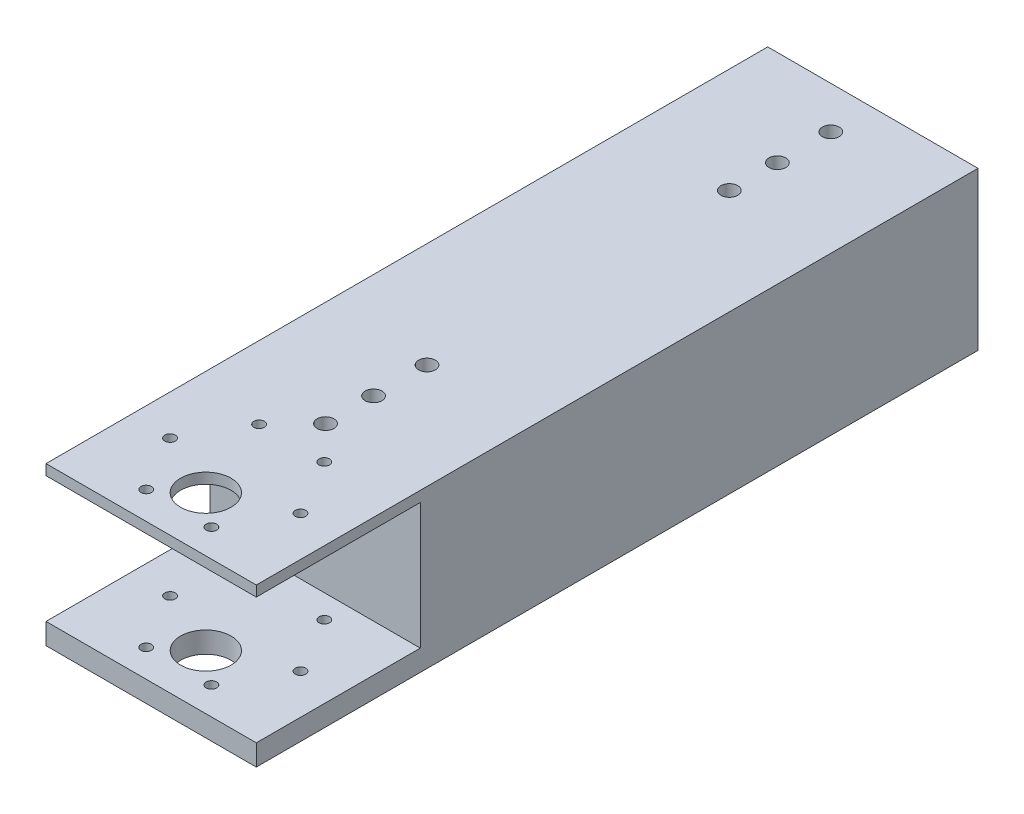
ISO-10303-21;
HEADER;
FILE_DESCRIPTION(('STEP AP214'),'2;1');
FILE_NAME('part.step','',(''),(''),'','','');
FILE_SCHEMA(('AUTOMOTIVE_DESIGN { 1 0 10303 214 1 1 1 1 }'));
ENDSEC;
DATA;
#1=APPLICATION_CONTEXT('core data for automotive mechanical design processes');
#2=APPLICATION_PROTOCOL_DEFINITION('international standard','automotive_design',2000,#1);
#3=PRODUCT_CONTEXT('',#1,'mechanical');
#4=PRODUCT('Part','Part','',(#3));
#5=PRODUCT_RELATED_PRODUCT_CATEGORY('part','',(#4));
#6=PRODUCT_DEFINITION_FORMATION('','',#4);
#7=PRODUCT_DEFINITION_CONTEXT('part definition',#1,'design');
#8=PRODUCT_DEFINITION('design','',#6,#7);
#9=PRODUCT_DEFINITION_SHAPE('','',#8);
#10=(LENGTH_UNIT() NAMED_UNIT(*) SI_UNIT(.MILLI.,.METRE.));
#11=(NAMED_UNIT(*) PLANE_ANGLE_UNIT() SI_UNIT($,.RADIAN.));
#12=(NAMED_UNIT(*) SI_UNIT($,.STERADIAN.) SOLID_ANGLE_UNIT());
#13=UNCERTAINTY_MEASURE_WITH_UNIT(LENGTH_MEASURE(1.E-05),#10,'distance_accuracy_value','');
#14=(GEOMETRIC_REPRESENTATION_CONTEXT(3) GLOBAL_UNCERTAINTY_ASSIGNED_CONTEXT((#13)) GLOBAL_UNIT_ASSIGNED_CONTEXT((#10,
#11,#12)) REPRESENTATION_CONTEXT('',''));
#15=CARTESIAN_POINT('',(0.,0.,0.));
#16=DIRECTION('',(0.,0.,1.));
#17=DIRECTION('',(1.,0.,0.));
#18=AXIS2_PLACEMENT_3D('',#15,#16,#17);
#19=CARTESIAN_POINT('',(-25.,37.5,0.));
#20=DIRECTION('',(1.,0.,0.));
#21=DIRECTION('',(0.,0.,-1.));
#22=AXIS2_PLACEMENT_3D('',#19,#20,#21);
#23=PLANE('',#22);
#24=DIRECTION('',(0.,0.,-1.));
#25=VECTOR('',#24,1.);
#26=CARTESIAN_POINT('',(-25.,35.,0.));
#27=LINE('',#26,#25);
#28=CARTESIAN_POINT('',(-25.,35.,0.));
#29=VERTEX_POINT('',#28);
#30=CARTESIAN_POINT('',(-25.,35.,-39.));
#31=VERTEX_POINT('',#30);
#32=EDGE_CURVE('E124',#29,#31,#27,.T.);
#33=ORIENTED_EDGE('',*,*,#32,.F.);
#34=DIRECTION('',(0.,-1.,0.));
#35=VECTOR('',#34,1.);
#36=CARTESIAN_POINT('',(-25.,37.5,0.));
#37=LINE('',#36,#35);
#38=CARTESIAN_POINT('',(-25.,37.5,0.));
#39=VERTEX_POINT('',#38);
#40=EDGE_CURVE('E11',#39,#29,#37,.T.);
#41=ORIENTED_EDGE('',*,*,#40,.F.);
#42=DIRECTION('',(0.,0.,1.));
#43=VECTOR('',#42,1.);
#44=CARTESIAN_POINT('',(-25.,37.5,0.));
#45=LINE('',#44,#43);
#46=CARTESIAN_POINT('',(-25.,37.5,-171.6));
#47=VERTEX_POINT('',#46);
#48=EDGE_CURVE('E178',#47,#39,#45,.T.);
#49=ORIENTED_EDGE('',*,*,#48,.F.);
#50=DIRECTION('',(0.,-1.,0.));
#51=VECTOR('',#50,1.);
#52=CARTESIAN_POINT('',(-25.,37.5,-171.6));
#53=LINE('',#52,#51);
#54=CARTESIAN_POINT('',(-25.,0.,-171.6));
#55=VERTEX_POINT('',#54);
#56=EDGE_CURVE('E184',#47,#55,#53,.T.);
#57=ORIENTED_EDGE('',*,*,#56,.T.);
#58=DIRECTION('',(0.,0.,1.));
#59=VECTOR('',#58,1.);
#60=CARTESIAN_POINT('',(-25.,0.,0.));
#61=LINE('',#60,#59);
#62=CARTESIAN_POINT('',(-25.,0.,0.));
#63=VERTEX_POINT('',#62);
#64=EDGE_CURVE('E175',#55,#63,#61,.T.);
#65=ORIENTED_EDGE('',*,*,#64,.T.);
#66=CARTESIAN_POINT('',(-25.,5.,0.));
#67=VERTEX_POINT('',#66);
#68=EDGE_CURVE('E47',#67,#63,#37,.T.);
#69=ORIENTED_EDGE('',*,*,#68,.F.);
#70=DIRECTION('',(0.,0.,-1.));
#71=VECTOR('',#70,1.);
#72=CARTESIAN_POINT('',(-25.,5.,0.));
#73=LINE('',#72,#71);
#74=CARTESIAN_POINT('',(-25.,5.,-39.));
#75=VERTEX_POINT('',#74);
#76=EDGE_CURVE('E135',#67,#75,#73,.T.);
#77=ORIENTED_EDGE('',*,*,#76,.T.);
#78=DIRECTION('',(0.,-1.,0.));
#79=VECTOR('',#78,1.);
#80=CARTESIAN_POINT('',(-25.,35.,-39.));
#81=LINE('',#80,#79);
#82=EDGE_CURVE('E117',#31,#75,#81,.T.);
#83=ORIENTED_EDGE('',*,*,#82,.F.);
#84=EDGE_LOOP('',(#33,#41,#49,#57,#65,#69,#77,#83));
#85=FACE_BOUND('',#84,.T.);
#86=ADVANCED_FACE('F40',(#85),#23,.F.);
#87=CARTESIAN_POINT('',(-25.,37.5,0.));
#88=DIRECTION('',(0.,0.,-1.));
#89=DIRECTION('',(-1.,0.,0.));
#90=AXIS2_PLACEMENT_3D('',#87,#88,#89);
#91=PLANE('',#90);
#92=DIRECTION('',(-1.,0.,0.));
#93=VECTOR('',#92,1.);
#94=CARTESIAN_POINT('',(-25.,35.,0.));
#95=LINE('',#94,#93);
#96=CARTESIAN_POINT('',(25.,35.,0.));
#97=VERTEX_POINT('',#96);
#98=EDGE_CURVE('E129',#97,#29,#95,.T.);
#99=ORIENTED_EDGE('',*,*,#98,.F.);
#100=DIRECTION('',(0.,-1.,0.));
#101=VECTOR('',#100,1.);
#102=CARTESIAN_POINT('',(25.,37.5,0.));
#103=LINE('',#102,#101);
#104=CARTESIAN_POINT('',(25.,37.5,0.));
#105=VERTEX_POINT('',#104);
#106=EDGE_CURVE('E196',#105,#97,#103,.T.);
#107=ORIENTED_EDGE('',*,*,#106,.F.);
#108=DIRECTION('',(1.,0.,0.));
#109=VECTOR('',#108,1.);
#110=CARTESIAN_POINT('',(-25.,37.5,0.));
#111=LINE('',#110,#109);
#112=EDGE_CURVE('E91',#39,#105,#111,.T.);
#113=ORIENTED_EDGE('',*,*,#112,.F.);
#114=ORIENTED_EDGE('',*,*,#40,.T.);
#115=EDGE_LOOP('',(#99,#107,#113,#114));
#116=FACE_BOUND('',#115,.T.);
#117=ADVANCED_FACE('F216',(#116),#91,.F.);
#118=CARTESIAN_POINT('',(25.,37.5,0.));
#119=DIRECTION('',(-1.,0.,0.));
#120=DIRECTION('',(0.,0.,1.));
#121=AXIS2_PLACEMENT_3D('',#118,#119,#120);
#122=PLANE('',#121);
#123=DIRECTION('',(0.,0.,1.));
#124=VECTOR('',#123,1.);
#125=CARTESIAN_POINT('',(25.,35.,0.));
#126=LINE('',#125,#124);
#127=CARTESIAN_POINT('',(25.,35.,-39.));
#128=VERTEX_POINT('',#127);
#129=EDGE_CURVE('E123',#128,#97,#126,.T.);
#130=ORIENTED_EDGE('',*,*,#129,.F.);
#131=DIRECTION('',(0.,-1.,0.));
#132=VECTOR('',#131,1.);
#133=CARTESIAN_POINT('',(25.,35.,-39.));
#134=LINE('',#133,#132);
#135=CARTESIAN_POINT('',(25.,5.,-39.));
#136=VERTEX_POINT('',#135);
#137=EDGE_CURVE('E120',#128,#136,#134,.T.);
#138=ORIENTED_EDGE('',*,*,#137,.T.);
#139=DIRECTION('',(0.,0.,1.));
#140=VECTOR('',#139,1.);
#141=CARTESIAN_POINT('',(25.,5.,0.));
#142=LINE('',#141,#140);
#143=CARTESIAN_POINT('',(25.,5.,0.));
#144=VERTEX_POINT('',#143);
#145=EDGE_CURVE('E204',#136,#144,#142,.T.);
#146=ORIENTED_EDGE('',*,*,#145,.T.);
#147=CARTESIAN_POINT('',(25.,0.,0.));
#148=VERTEX_POINT('',#147);
#149=EDGE_CURVE('E195',#144,#148,#103,.T.);
#150=ORIENTED_EDGE('',*,*,#149,.T.);
#151=DIRECTION('',(0.,0.,-1.));
#152=VECTOR('',#151,1.);
#153=CARTESIAN_POINT('',(25.,0.,0.));
#154=LINE('',#153,#152);
#155=CARTESIAN_POINT('',(25.,0.,-171.6));
#156=VERTEX_POINT('',#155);
#157=EDGE_CURVE('E190',#148,#156,#154,.T.);
#158=ORIENTED_EDGE('',*,*,#157,.T.);
#159=DIRECTION('',(0.,-1.,0.));
#160=VECTOR('',#159,1.);
#161=CARTESIAN_POINT('',(25.,37.5,-171.6));
#162=LINE('',#161,#160);
#163=CARTESIAN_POINT('',(25.,37.5,-171.6));
#164=VERTEX_POINT('',#163);
#165=EDGE_CURVE('E194',#164,#156,#162,.T.);
#166=ORIENTED_EDGE('',*,*,#165,.F.);
#167=DIRECTION('',(0.,0.,-1.));
#168=VECTOR('',#167,1.);
#169=CARTESIAN_POINT('',(25.,37.5,0.));
#170=LINE('',#169,#168);
#171=EDGE_CURVE('E181',#105,#164,#170,.T.);
#172=ORIENTED_EDGE('',*,*,#171,.F.);
#173=ORIENTED_EDGE('',*,*,#106,.T.);
#174=EDGE_LOOP('',(#130,#138,#146,#150,#158,#166,#172,#173));
#175=FACE_BOUND('',#174,.T.);
#176=ADVANCED_FACE('F201',(#175),#122,.F.);
#177=CARTESIAN_POINT('',(0.,37.5,0.));
#178=DIRECTION('',(0.,-1.,0.));
#179=DIRECTION('',(0.,0.,-1.));
#180=AXIS2_PLACEMENT_3D('',#177,#178,#179);
#181=PLANE('',#180);
#182=CARTESIAN_POINT('',(7.74999999999995,37.5,-6.57660624134127));
#183=DIRECTION('',(0.,-1.,0.));
#184=DIRECTION('',(0.,0.,-1.));
#185=AXIS2_PLACEMENT_3D('',#182,#183,#184);
#186=CIRCLE('',#185,1.25000000000002);
#187=CARTESIAN_POINT('',(7.74999999999995,37.5,-7.82660624134129));
#188=VERTEX_POINT('',#187);
#189=EDGE_CURVE('E381',#188,#188,#186,.T.);
#190=ORIENTED_EDGE('',*,*,#189,.T.);
#191=EDGE_LOOP('',(#190));
#192=FACE_BOUND('',#191,.T.);
#193=CARTESIAN_POINT('',(-7.74999999999996,37.5,-6.57660624134127));
#194=DIRECTION('',(0.,-1.,0.));
#195=DIRECTION('',(0.,0.,-1.));
#196=AXIS2_PLACEMENT_3D('',#193,#194,#195);
#197=CIRCLE('',#196,1.25000000000001);
#198=CARTESIAN_POINT('',(-7.74999999999996,37.5,-7.82660624134129));
#199=VERTEX_POINT('',#198);
#200=EDGE_CURVE('E372',#199,#199,#197,.T.);
#201=ORIENTED_EDGE('',*,*,#200,.T.);
#202=EDGE_LOOP('',(#201));
#203=FACE_BOUND('',#202,.T.);
#204=CARTESIAN_POINT('',(0.,37.5,-13.));
#205=DIRECTION('',(0.,-1.,0.));
#206=DIRECTION('',(0.,0.,-1.));
#207=AXIS2_PLACEMENT_3D('',#204,#205,#206);
#208=CIRCLE('',#207,5.99999999999999);
#209=CARTESIAN_POINT('',(0.,37.5,-19.));
#210=VERTEX_POINT('',#209);
#211=EDGE_CURVE('E378',#210,#210,#208,.T.);
#212=ORIENTED_EDGE('',*,*,#211,.T.);
#213=EDGE_LOOP('',(#212));
#214=FACE_BOUND('',#213,.T.);
#215=CARTESIAN_POINT('',(7.74999999999997,37.5,-33.4233937586587));
#216=DIRECTION('',(0.,-1.,0.));
#217=DIRECTION('',(0.,0.,-1.));
#218=AXIS2_PLACEMENT_3D('',#215,#216,#217);
#219=CIRCLE('',#218,1.25000000000001);
#220=CARTESIAN_POINT('',(7.74999999999997,37.5,-34.6733937586587));
#221=VERTEX_POINT('',#220);
#222=EDGE_CURVE('E393',#221,#221,#219,.T.);
#223=ORIENTED_EDGE('',*,*,#222,.T.);
#224=EDGE_LOOP('',(#223));
#225=FACE_BOUND('',#224,.T.);
#226=CARTESIAN_POINT('',(-15.4999999999999,37.5,-20.));
#227=DIRECTION('',(0.,-1.,0.));
#228=DIRECTION('',(0.,0.,-1.));
#229=AXIS2_PLACEMENT_3D('',#226,#227,#228);
#230=CIRCLE('',#229,1.25000000000001);
#231=CARTESIAN_POINT('',(-15.4999999999999,37.5,-21.25));
#232=VERTEX_POINT('',#231);
#233=EDGE_CURVE('E392',#232,#232,#230,.T.);
#234=ORIENTED_EDGE('',*,*,#233,.T.);
#235=EDGE_LOOP('',(#234));
#236=FACE_BOUND('',#235,.T.);
#237=CARTESIAN_POINT('',(15.4999999999999,37.5,-20.));
#238=DIRECTION('',(0.,-1.,0.));
#239=DIRECTION('',(0.,0.,-1.));
#240=AXIS2_PLACEMENT_3D('',#237,#238,#239);
#241=CIRCLE('',#240,1.25000000000001);
#242=CARTESIAN_POINT('',(15.4999999999999,37.5,-21.25));
#243=VERTEX_POINT('',#242);
#244=EDGE_CURVE('E625',#243,#243,#241,.T.);
#245=ORIENTED_EDGE('',*,*,#244,.T.);
#246=EDGE_LOOP('',(#245));
#247=FACE_BOUND('',#246,.T.);
#248=CARTESIAN_POINT('',(-7.74999999999996,37.5,-33.4233937586587));
#249=DIRECTION('',(0.,-1.,0.));
#250=DIRECTION('',(0.,0.,-1.));
#251=AXIS2_PLACEMENT_3D('',#248,#249,#250);
#252=CIRCLE('',#251,1.25000000000001);
#253=CARTESIAN_POINT('',(-7.74999999999996,37.5,-34.6733937586587));
#254=VERTEX_POINT('',#253);
#255=EDGE_CURVE('E402',#254,#254,#252,.T.);
#256=ORIENTED_EDGE('',*,*,#255,.T.);
#257=EDGE_LOOP('',(#256));
#258=FACE_BOUND('',#257,.T.);
#259=ORIENTED_EDGE('',*,*,#48,.T.);
#260=ORIENTED_EDGE('',*,*,#112,.T.);
#261=ORIENTED_EDGE('',*,*,#171,.T.);
#262=DIRECTION('',(-1.,0.,0.));
#263=VECTOR('',#262,1.);
#264=CARTESIAN_POINT('',(-25.,37.5,-171.6));
#265=LINE('',#264,#263);
#266=EDGE_CURVE('E63',#164,#47,#265,.T.);
#267=ORIENTED_EDGE('',*,*,#266,.T.);
#268=EDGE_LOOP('',(#259,#260,#261,#267));
#269=FACE_BOUND('',#268,.T.);
#270=CARTESIAN_POINT('',(0.,37.5,-148.9));
#271=DIRECTION('',(0.,1.,0.));
#272=DIRECTION('',(0.,0.,1.));
#273=AXIS2_PLACEMENT_3D('',#270,#271,#272);
#274=CIRCLE('',#273,2.);
#275=CARTESIAN_POINT('',(0.,37.5,-146.9));
#276=VERTEX_POINT('',#275);
#277=EDGE_CURVE('E172',#276,#276,#274,.T.);
#278=ORIENTED_EDGE('',*,*,#277,.F.);
#279=EDGE_LOOP('',(#278));
#280=FACE_BOUND('',#279,.T.);
#281=CARTESIAN_POINT('',(0.,37.5,-137.47));
#282=DIRECTION('',(0.,1.,0.));
#283=DIRECTION('',(0.,0.,1.));
#284=AXIS2_PLACEMENT_3D('',#281,#282,#283);
#285=CIRCLE('',#284,2.);
#286=CARTESIAN_POINT('',(0.,37.5,-135.47));
#287=VERTEX_POINT('',#286);
#288=EDGE_CURVE('E166',#287,#287,#285,.T.);
#289=ORIENTED_EDGE('',*,*,#288,.F.);
#290=EDGE_LOOP('',(#289));
#291=FACE_BOUND('',#290,.T.);
#292=CARTESIAN_POINT('',(0.,37.5,-161.6));
#293=DIRECTION('',(0.,1.,0.));
#294=DIRECTION('',(0.,0.,1.));
#295=AXIS2_PLACEMENT_3D('',#292,#293,#294);
#296=CIRCLE('',#295,2.);
#297=CARTESIAN_POINT('',(0.,37.5,-159.6));
#298=VERTEX_POINT('',#297);
#299=EDGE_CURVE('E160',#298,#298,#296,.T.);
#300=ORIENTED_EDGE('',*,*,#299,.F.);
#301=EDGE_LOOP('',(#300));
#302=FACE_BOUND('',#301,.T.);
#303=CARTESIAN_POINT('',(0.,37.5,-52.888));
#304=DIRECTION('',(0.,1.,0.));
#305=DIRECTION('',(0.,0.,1.));
#306=AXIS2_PLACEMENT_3D('',#303,#304,#305);
#307=CIRCLE('',#306,2.);
#308=CARTESIAN_POINT('',(0.,37.5,-50.888));
#309=VERTEX_POINT('',#308);
#310=EDGE_CURVE('E154',#309,#309,#307,.T.);
#311=ORIENTED_EDGE('',*,*,#310,.F.);
#312=EDGE_LOOP('',(#311));
#313=FACE_BOUND('',#312,.T.);
#314=CARTESIAN_POINT('',(0.,37.5,-65.588));
#315=DIRECTION('',(0.,1.,0.));
#316=DIRECTION('',(0.,0.,1.));
#317=AXIS2_PLACEMENT_3D('',#314,#315,#316);
#318=CIRCLE('',#317,2.);
#319=CARTESIAN_POINT('',(0.,37.5,-63.588));
#320=VERTEX_POINT('',#319);
#321=EDGE_CURVE('E148',#320,#320,#318,.T.);
#322=ORIENTED_EDGE('',*,*,#321,.F.);
#323=EDGE_LOOP('',(#322));
#324=FACE_BOUND('',#323,.T.);
#325=CARTESIAN_POINT('',(0.,37.5,-41.458));
#326=DIRECTION('',(0.,1.,0.));
#327=DIRECTION('',(0.,0.,1.));
#328=AXIS2_PLACEMENT_3D('',#325,#326,#327);
#329=CIRCLE('',#328,2.);
#330=CARTESIAN_POINT('',(0.,37.5,-39.458));
#331=VERTEX_POINT('',#330);
#332=EDGE_CURVE('E142',#331,#331,#329,.T.);
#333=ORIENTED_EDGE('',*,*,#332,.F.);
#334=EDGE_LOOP('',(#333));
#335=FACE_BOUND('',#334,.T.);
#336=ADVANCED_FACE('F214',(#192,#203,#214,#225,#236,#247,#258,#269,#280,#291,#302,#313,#324,
#335),#181,.F.);
#337=CARTESIAN_POINT('',(0.,0.,0.));
#338=DIRECTION('',(0.,-1.,0.));
#339=DIRECTION('',(0.,0.,-1.));
#340=AXIS2_PLACEMENT_3D('',#337,#338,#339);
#341=PLANE('',#340);
#342=CARTESIAN_POINT('',(7.74999999999995,0.,-6.57660624134127));
#343=DIRECTION('',(0.,-1.,0.));
#344=DIRECTION('',(0.,0.,-1.));
#345=AXIS2_PLACEMENT_3D('',#342,#343,#344);
#346=CIRCLE('',#345,1.25000000000002);
#347=CARTESIAN_POINT('',(7.74999999999995,0.,-7.82660624134129));
#348=VERTEX_POINT('',#347);
#349=EDGE_CURVE('E389',#348,#348,#346,.T.);
#350=ORIENTED_EDGE('',*,*,#349,.F.);
#351=EDGE_LOOP('',(#350));
#352=FACE_BOUND('',#351,.T.);
#353=CARTESIAN_POINT('',(-7.74999999999996,0.,-6.57660624134127));
#354=DIRECTION('',(0.,-1.,0.));
#355=DIRECTION('',(0.,0.,-1.));
#356=AXIS2_PLACEMENT_3D('',#353,#354,#355);
#357=CIRCLE('',#356,1.25000000000001);
#358=CARTESIAN_POINT('',(-7.74999999999996,0.,-7.82660624134129));
#359=VERTEX_POINT('',#358);
#360=EDGE_CURVE('E375',#359,#359,#357,.T.);
#361=ORIENTED_EDGE('',*,*,#360,.F.);
#362=EDGE_LOOP('',(#361));
#363=FACE_BOUND('',#362,.T.);
#364=CARTESIAN_POINT('',(0.,0.,-13.));
#365=DIRECTION('',(0.,-1.,0.));
#366=DIRECTION('',(0.,0.,-1.));
#367=AXIS2_PLACEMENT_3D('',#364,#365,#366);
#368=CIRCLE('',#367,5.99999999999999);
#369=CARTESIAN_POINT('',(0.,0.,-19.));
#370=VERTEX_POINT('',#369);
#371=EDGE_CURVE('E374',#370,#370,#368,.T.);
#372=ORIENTED_EDGE('',*,*,#371,.F.);
#373=EDGE_LOOP('',(#372));
#374=FACE_BOUND('',#373,.T.);
#375=CARTESIAN_POINT('',(7.74999999999997,0.,-33.4233937586587));
#376=DIRECTION('',(0.,-1.,0.));
#377=DIRECTION('',(0.,0.,-1.));
#378=AXIS2_PLACEMENT_3D('',#375,#376,#377);
#379=CIRCLE('',#378,1.25000000000001);
#380=CARTESIAN_POINT('',(7.74999999999997,0.,-34.6733937586587));
#381=VERTEX_POINT('',#380);
#382=EDGE_CURVE('E397',#381,#381,#379,.T.);
#383=ORIENTED_EDGE('',*,*,#382,.F.);
#384=EDGE_LOOP('',(#383));
#385=FACE_BOUND('',#384,.T.);
#386=CARTESIAN_POINT('',(-15.4999999999999,0.,-20.));
#387=DIRECTION('',(0.,-1.,0.));
#388=DIRECTION('',(0.,0.,-1.));
#389=AXIS2_PLACEMENT_3D('',#386,#387,#388);
#390=CIRCLE('',#389,1.25000000000001);
#391=CARTESIAN_POINT('',(-15.4999999999999,0.,-21.25));
#392=VERTEX_POINT('',#391);
#393=EDGE_CURVE('E322',#392,#392,#390,.T.);
#394=ORIENTED_EDGE('',*,*,#393,.F.);
#395=EDGE_LOOP('',(#394));
#396=FACE_BOUND('',#395,.T.);
#397=CARTESIAN_POINT('',(15.4999999999999,0.,-20.));
#398=DIRECTION('',(0.,-1.,0.));
#399=DIRECTION('',(0.,0.,-1.));
#400=AXIS2_PLACEMENT_3D('',#397,#398,#399);
#401=CIRCLE('',#400,1.25000000000001);
#402=CARTESIAN_POINT('',(15.4999999999999,0.,-21.25));
#403=VERTEX_POINT('',#402);
#404=EDGE_CURVE('E384',#403,#403,#401,.T.);
#405=ORIENTED_EDGE('',*,*,#404,.F.);
#406=EDGE_LOOP('',(#405));
#407=FACE_BOUND('',#406,.T.);
#408=CARTESIAN_POINT('',(-7.74999999999996,0.,-33.4233937586587));
#409=DIRECTION('',(0.,-1.,0.));
#410=DIRECTION('',(0.,0.,-1.));
#411=AXIS2_PLACEMENT_3D('',#408,#409,#410);
#412=CIRCLE('',#411,1.25000000000001);
#413=CARTESIAN_POINT('',(-7.74999999999996,0.,-34.6733937586587));
#414=VERTEX_POINT('',#413);
#415=EDGE_CURVE('E396',#414,#414,#412,.T.);
#416=ORIENTED_EDGE('',*,*,#415,.F.);
#417=EDGE_LOOP('',(#416));
#418=FACE_BOUND('',#417,.T.);
#419=CARTESIAN_POINT('',(0.,0.,-65.588));
#420=DIRECTION('',(0.,1.,0.));
#421=DIRECTION('',(0.,0.,1.));
#422=AXIS2_PLACEMENT_3D('',#419,#420,#421);
#423=CIRCLE('',#422,2.);
#424=CARTESIAN_POINT('',(0.,0.,-63.588));
#425=VERTEX_POINT('',#424);
#426=EDGE_CURVE('E145',#425,#425,#423,.T.);
#427=ORIENTED_EDGE('',*,*,#426,.T.);
#428=EDGE_LOOP('',(#427));
#429=FACE_BOUND('',#428,.T.);
#430=CARTESIAN_POINT('',(0.,0.,-161.6));
#431=DIRECTION('',(0.,1.,0.));
#432=DIRECTION('',(0.,0.,1.));
#433=AXIS2_PLACEMENT_3D('',#430,#431,#432);
#434=CIRCLE('',#433,2.);
#435=CARTESIAN_POINT('',(0.,0.,-159.6));
#436=VERTEX_POINT('',#435);
#437=EDGE_CURVE('E157',#436,#436,#434,.T.);
#438=ORIENTED_EDGE('',*,*,#437,.T.);
#439=EDGE_LOOP('',(#438));
#440=FACE_BOUND('',#439,.T.);
#441=CARTESIAN_POINT('',(0.,0.,-148.9));
#442=DIRECTION('',(0.,1.,0.));
#443=DIRECTION('',(0.,0.,1.));
#444=AXIS2_PLACEMENT_3D('',#441,#442,#443);
#445=CIRCLE('',#444,2.);
#446=CARTESIAN_POINT('',(0.,0.,-146.9));
#447=VERTEX_POINT('',#446);
#448=EDGE_CURVE('E169',#447,#447,#445,.T.);
#449=ORIENTED_EDGE('',*,*,#448,.T.);
#450=EDGE_LOOP('',(#449));
#451=FACE_BOUND('',#450,.T.);
#452=ORIENTED_EDGE('',*,*,#64,.F.);
#453=DIRECTION('',(-1.,0.,0.));
#454=VECTOR('',#453,1.);
#455=CARTESIAN_POINT('',(-25.,0.,-171.6));
#456=LINE('',#455,#454);
#457=EDGE_CURVE('E84',#156,#55,#456,.T.);
#458=ORIENTED_EDGE('',*,*,#457,.F.);
#459=ORIENTED_EDGE('',*,*,#157,.F.);
#460=DIRECTION('',(1.,0.,0.));
#461=VECTOR('',#460,1.);
#462=CARTESIAN_POINT('',(-25.,0.,0.));
#463=LINE('',#462,#461);
#464=EDGE_CURVE('E187',#63,#148,#463,.T.);
#465=ORIENTED_EDGE('',*,*,#464,.F.);
#466=EDGE_LOOP('',(#452,#458,#459,#465));
#467=FACE_BOUND('',#466,.T.);
#468=CARTESIAN_POINT('',(0.,0.,-137.47));
#469=DIRECTION('',(0.,1.,0.));
#470=DIRECTION('',(0.,0.,1.));
#471=AXIS2_PLACEMENT_3D('',#468,#469,#470);
#472=CIRCLE('',#471,2.);
#473=CARTESIAN_POINT('',(0.,0.,-135.47));
#474=VERTEX_POINT('',#473);
#475=EDGE_CURVE('E163',#474,#474,#472,.T.);
#476=ORIENTED_EDGE('',*,*,#475,.T.);
#477=EDGE_LOOP('',(#476));
#478=FACE_BOUND('',#477,.T.);
#479=CARTESIAN_POINT('',(0.,0.,-52.888));
#480=DIRECTION('',(0.,1.,0.));
#481=DIRECTION('',(0.,0.,1.));
#482=AXIS2_PLACEMENT_3D('',#479,#480,#481);
#483=CIRCLE('',#482,2.);
#484=CARTESIAN_POINT('',(0.,0.,-50.888));
#485=VERTEX_POINT('',#484);
#486=EDGE_CURVE('E151',#485,#485,#483,.T.);
#487=ORIENTED_EDGE('',*,*,#486,.T.);
#488=EDGE_LOOP('',(#487));
#489=FACE_BOUND('',#488,.T.);
#490=CARTESIAN_POINT('',(0.,0.,-41.458));
#491=DIRECTION('',(0.,1.,0.));
#492=DIRECTION('',(0.,0.,1.));
#493=AXIS2_PLACEMENT_3D('',#490,#491,#492);
#494=CIRCLE('',#493,2.);
#495=CARTESIAN_POINT('',(0.,0.,-39.458));
#496=VERTEX_POINT('',#495);
#497=EDGE_CURVE('E137',#496,#496,#494,.T.);
#498=ORIENTED_EDGE('',*,*,#497,.T.);
#499=EDGE_LOOP('',(#498));
#500=FACE_BOUND('',#499,.T.);
#501=ADVANCED_FACE('F210',(#352,#363,#374,#385,#396,#407,#418,#429,#440,#451,#467,#478,#489,
#500),#341,.T.);
#502=ORIENTED_EDGE('',*,*,#149,.F.);
#503=DIRECTION('',(-1.,0.,0.));
#504=VECTOR('',#503,1.);
#505=CARTESIAN_POINT('',(-25.,5.,0.));
#506=LINE('',#505,#504);
#507=EDGE_CURVE('E54',#144,#67,#506,.T.);
#508=ORIENTED_EDGE('',*,*,#507,.T.);
#509=ORIENTED_EDGE('',*,*,#68,.T.);
#510=ORIENTED_EDGE('',*,*,#464,.T.);
#511=EDGE_LOOP('',(#502,#508,#509,#510));
#512=FACE_BOUND('',#511,.T.);
#513=ADVANCED_FACE('F207',(#512),#91,.F.);
#514=CARTESIAN_POINT('',(-25.,37.5,-171.6));
#515=DIRECTION('',(0.,0.,1.));
#516=DIRECTION('',(1.,0.,0.));
#517=AXIS2_PLACEMENT_3D('',#514,#515,#516);
#518=PLANE('',#517);
#519=ORIENTED_EDGE('',*,*,#457,.T.);
#520=ORIENTED_EDGE('',*,*,#56,.F.);
#521=ORIENTED_EDGE('',*,*,#266,.F.);
#522=ORIENTED_EDGE('',*,*,#165,.T.);
#523=EDGE_LOOP('',(#519,#520,#521,#522));
#524=FACE_BOUND('',#523,.T.);
#525=ADVANCED_FACE('F213',(#524),#518,.F.);
#526=CARTESIAN_POINT('',(0.,37.5,-148.9));
#527=DIRECTION('',(0.,-1.,0.));
#528=DIRECTION('',(0.,0.,-1.));
#529=AXIS2_PLACEMENT_3D('',#526,#527,#528);
#530=CYLINDRICAL_SURFACE('',#529,2.);
#531=ORIENTED_EDGE('',*,*,#277,.T.);
#532=EDGE_LOOP('',(#531));
#533=FACE_BOUND('',#532,.T.);
#534=ORIENTED_EDGE('',*,*,#448,.F.);
#535=EDGE_LOOP('',(#534));
#536=FACE_BOUND('',#535,.T.);
#537=ADVANCED_FACE('F228',(#533,#536),#530,.F.);
#538=CARTESIAN_POINT('',(0.,37.5,-137.47));
#539=DIRECTION('',(0.,-1.,0.));
#540=DIRECTION('',(0.,0.,-1.));
#541=AXIS2_PLACEMENT_3D('',#538,#539,#540);
#542=CYLINDRICAL_SURFACE('',#541,2.);
#543=ORIENTED_EDGE('',*,*,#288,.T.);
#544=EDGE_LOOP('',(#543));
#545=FACE_BOUND('',#544,.T.);
#546=ORIENTED_EDGE('',*,*,#475,.F.);
#547=EDGE_LOOP('',(#546));
#548=FACE_BOUND('',#547,.T.);
#549=ADVANCED_FACE('F244',(#545,#548),#542,.F.);
#550=CARTESIAN_POINT('',(0.,37.5,-161.6));
#551=DIRECTION('',(0.,-1.,0.));
#552=DIRECTION('',(0.,0.,-1.));
#553=AXIS2_PLACEMENT_3D('',#550,#551,#552);
#554=CYLINDRICAL_SURFACE('',#553,2.);
#555=ORIENTED_EDGE('',*,*,#299,.T.);
#556=EDGE_LOOP('',(#555));
#557=FACE_BOUND('',#556,.T.);
#558=ORIENTED_EDGE('',*,*,#437,.F.);
#559=EDGE_LOOP('',(#558));
#560=FACE_BOUND('',#559,.T.);
#561=ADVANCED_FACE('F248',(#557,#560),#554,.F.);
#562=CARTESIAN_POINT('',(0.,37.5,-52.888));
#563=DIRECTION('',(0.,-1.,0.));
#564=DIRECTION('',(0.,0.,-1.));
#565=AXIS2_PLACEMENT_3D('',#562,#563,#564);
#566=CYLINDRICAL_SURFACE('',#565,2.);
#567=ORIENTED_EDGE('',*,*,#310,.T.);
#568=EDGE_LOOP('',(#567));
#569=FACE_BOUND('',#568,.T.);
#570=ORIENTED_EDGE('',*,*,#486,.F.);
#571=EDGE_LOOP('',(#570));
#572=FACE_BOUND('',#571,.T.);
#573=ADVANCED_FACE('F252',(#569,#572),#566,.F.);
#574=CARTESIAN_POINT('',(0.,37.5,-65.588));
#575=DIRECTION('',(0.,-1.,0.));
#576=DIRECTION('',(0.,0.,-1.));
#577=AXIS2_PLACEMENT_3D('',#574,#575,#576);
#578=CYLINDRICAL_SURFACE('',#577,2.);
#579=ORIENTED_EDGE('',*,*,#321,.T.);
#580=EDGE_LOOP('',(#579));
#581=FACE_BOUND('',#580,.T.);
#582=ORIENTED_EDGE('',*,*,#426,.F.);
#583=EDGE_LOOP('',(#582));
#584=FACE_BOUND('',#583,.T.);
#585=ADVANCED_FACE('F256',(#581,#584),#578,.F.);
#586=CARTESIAN_POINT('',(0.,37.5,-41.458));
#587=DIRECTION('',(0.,-1.,0.));
#588=DIRECTION('',(0.,0.,-1.));
#589=AXIS2_PLACEMENT_3D('',#586,#587,#588);
#590=CYLINDRICAL_SURFACE('',#589,2.);
#591=ORIENTED_EDGE('',*,*,#332,.T.);
#592=EDGE_LOOP('',(#591));
#593=FACE_BOUND('',#592,.T.);
#594=ORIENTED_EDGE('',*,*,#497,.F.);
#595=EDGE_LOOP('',(#594));
#596=FACE_BOUND('',#595,.T.);
#597=ADVANCED_FACE('F260',(#593,#596),#590,.F.);
#598=CARTESIAN_POINT('',(-25.,35.,-39.));
#599=DIRECTION('',(0.,0.,-1.));
#600=DIRECTION('',(-1.,0.,0.));
#601=AXIS2_PLACEMENT_3D('',#598,#599,#600);
#602=PLANE('',#601);
#603=DIRECTION('',(1.,0.,0.));
#604=VECTOR('',#603,1.);
#605=CARTESIAN_POINT('',(-25.,5.,-39.));
#606=LINE('',#605,#604);
#607=EDGE_CURVE('E362',#75,#136,#606,.T.);
#608=ORIENTED_EDGE('',*,*,#607,.T.);
#609=ORIENTED_EDGE('',*,*,#137,.F.);
#610=DIRECTION('',(1.,0.,0.));
#611=VECTOR('',#610,1.);
#612=CARTESIAN_POINT('',(-25.,35.,-39.));
#613=LINE('',#612,#611);
#614=EDGE_CURVE('E112',#31,#128,#613,.T.);
#615=ORIENTED_EDGE('',*,*,#614,.F.);
#616=ORIENTED_EDGE('',*,*,#82,.T.);
#617=EDGE_LOOP('',(#608,#609,#615,#616));
#618=FACE_BOUND('',#617,.T.);
#619=ADVANCED_FACE('F115',(#618),#602,.F.);
#620=CARTESIAN_POINT('',(0.,35.,0.));
#621=DIRECTION('',(0.,-1.,0.));
#622=DIRECTION('',(0.,0.,-1.));
#623=AXIS2_PLACEMENT_3D('',#620,#621,#622);
#624=PLANE('',#623);
#625=CARTESIAN_POINT('',(-7.74999999999996,35.,-33.4233937586587));
#626=DIRECTION('',(0.,-1.,0.));
#627=DIRECTION('',(0.,0.,-1.));
#628=AXIS2_PLACEMENT_3D('',#625,#626,#627);
#629=CIRCLE('',#628,1.25000000000001);
#630=CARTESIAN_POINT('',(-7.74999999999996,35.,-34.6733937586587));
#631=VERTEX_POINT('',#630);
#632=EDGE_CURVE('E410',#631,#631,#629,.T.);
#633=ORIENTED_EDGE('',*,*,#632,.F.);
#634=EDGE_LOOP('',(#633));
#635=FACE_BOUND('',#634,.T.);
#636=CARTESIAN_POINT('',(7.74999999999997,35.,-33.4233937586587));
#637=DIRECTION('',(0.,-1.,0.));
#638=DIRECTION('',(0.,0.,-1.));
#639=AXIS2_PLACEMENT_3D('',#636,#637,#638);
#640=CIRCLE('',#639,1.25000000000001);
#641=CARTESIAN_POINT('',(7.74999999999997,35.,-34.6733937586587));
#642=VERTEX_POINT('',#641);
#643=EDGE_CURVE('E339',#642,#642,#640,.T.);
#644=ORIENTED_EDGE('',*,*,#643,.F.);
#645=EDGE_LOOP('',(#644));
#646=FACE_BOUND('',#645,.T.);
#647=CARTESIAN_POINT('',(15.4999999999999,35.,-20.));
#648=DIRECTION('',(0.,-1.,0.));
#649=DIRECTION('',(0.,0.,-1.));
#650=AXIS2_PLACEMENT_3D('',#647,#648,#649);
#651=CIRCLE('',#650,1.25000000000001);
#652=CARTESIAN_POINT('',(15.4999999999999,35.,-21.25));
#653=VERTEX_POINT('',#652);
#654=EDGE_CURVE('E328',#653,#653,#651,.T.);
#655=ORIENTED_EDGE('',*,*,#654,.F.);
#656=EDGE_LOOP('',(#655));
#657=FACE_BOUND('',#656,.T.);
#658=CARTESIAN_POINT('',(0.,35.,-13.));
#659=DIRECTION('',(0.,-1.,0.));
#660=DIRECTION('',(0.,0.,-1.));
#661=AXIS2_PLACEMENT_3D('',#658,#659,#660);
#662=CIRCLE('',#661,5.99999999999999);
#663=CARTESIAN_POINT('',(0.,35.,-19.));
#664=VERTEX_POINT('',#663);
#665=EDGE_CURVE('E345',#664,#664,#662,.T.);
#666=ORIENTED_EDGE('',*,*,#665,.F.);
#667=EDGE_LOOP('',(#666));
#668=FACE_BOUND('',#667,.T.);
#669=CARTESIAN_POINT('',(-15.4999999999999,35.,-20.));
#670=DIRECTION('',(0.,-1.,0.));
#671=DIRECTION('',(0.,0.,-1.));
#672=AXIS2_PLACEMENT_3D('',#669,#670,#671);
#673=CIRCLE('',#672,1.25000000000001);
#674=CARTESIAN_POINT('',(-15.4999999999999,35.,-21.25));
#675=VERTEX_POINT('',#674);
#676=EDGE_CURVE('E327',#675,#675,#673,.T.);
#677=ORIENTED_EDGE('',*,*,#676,.F.);
#678=EDGE_LOOP('',(#677));
#679=FACE_BOUND('',#678,.T.);
#680=CARTESIAN_POINT('',(7.74999999999995,35.,-6.57660624134127));
#681=DIRECTION('',(0.,-1.,0.));
#682=DIRECTION('',(0.,0.,-1.));
#683=AXIS2_PLACEMENT_3D('',#680,#681,#682);
#684=CIRCLE('',#683,1.25000000000002);
#685=CARTESIAN_POINT('',(7.74999999999995,35.,-7.82660624134129));
#686=VERTEX_POINT('',#685);
#687=EDGE_CURVE('E357',#686,#686,#684,.T.);
#688=ORIENTED_EDGE('',*,*,#687,.F.);
#689=EDGE_LOOP('',(#688));
#690=FACE_BOUND('',#689,.T.);
#691=CARTESIAN_POINT('',(-7.74999999999996,35.,-6.57660624134127));
#692=DIRECTION('',(0.,-1.,0.));
#693=DIRECTION('',(0.,0.,-1.));
#694=AXIS2_PLACEMENT_3D('',#691,#692,#693);
#695=CIRCLE('',#694,1.25000000000001);
#696=CARTESIAN_POINT('',(-7.74999999999996,35.,-7.82660624134129));
#697=VERTEX_POINT('',#696);
#698=EDGE_CURVE('E351',#697,#697,#695,.T.);
#699=ORIENTED_EDGE('',*,*,#698,.F.);
#700=EDGE_LOOP('',(#699));
#701=FACE_BOUND('',#700,.T.);
#702=ORIENTED_EDGE('',*,*,#32,.T.);
#703=ORIENTED_EDGE('',*,*,#614,.T.);
#704=ORIENTED_EDGE('',*,*,#129,.T.);
#705=ORIENTED_EDGE('',*,*,#98,.T.);
#706=EDGE_LOOP('',(#702,#703,#704,#705));
#707=FACE_BOUND('',#706,.T.);
#708=ADVANCED_FACE('F127',(#635,#646,#657,#668,#679,#690,#701,#707),#624,.T.);
#709=CARTESIAN_POINT('',(0.,5.,0.));
#710=DIRECTION('',(0.,-1.,0.));
#711=DIRECTION('',(0.,0.,-1.));
#712=AXIS2_PLACEMENT_3D('',#709,#710,#711);
#713=PLANE('',#712);
#714=CARTESIAN_POINT('',(-7.74999999999996,5.,-33.4233937586587));
#715=DIRECTION('',(0.,-1.,0.));
#716=DIRECTION('',(0.,0.,-1.));
#717=AXIS2_PLACEMENT_3D('',#714,#715,#716);
#718=CIRCLE('',#717,1.25000000000001);
#719=CARTESIAN_POINT('',(-7.74999999999996,5.,-34.6733937586587));
#720=VERTEX_POINT('',#719);
#721=EDGE_CURVE('E405',#720,#720,#718,.T.);
#722=ORIENTED_EDGE('',*,*,#721,.T.);
#723=EDGE_LOOP('',(#722));
#724=FACE_BOUND('',#723,.T.);
#725=CARTESIAN_POINT('',(7.74999999999997,5.,-33.4233937586587));
#726=DIRECTION('',(0.,-1.,0.));
#727=DIRECTION('',(0.,0.,-1.));
#728=AXIS2_PLACEMENT_3D('',#725,#726,#727);
#729=CIRCLE('',#728,1.25000000000001);
#730=CARTESIAN_POINT('',(7.74999999999997,5.,-34.6733937586587));
#731=VERTEX_POINT('',#730);
#732=EDGE_CURVE('E330',#731,#731,#729,.T.);
#733=ORIENTED_EDGE('',*,*,#732,.T.);
#734=EDGE_LOOP('',(#733));
#735=FACE_BOUND('',#734,.T.);
#736=CARTESIAN_POINT('',(15.4999999999999,5.,-20.));
#737=DIRECTION('',(0.,-1.,0.));
#738=DIRECTION('',(0.,0.,-1.));
#739=AXIS2_PLACEMENT_3D('',#736,#737,#738);
#740=CIRCLE('',#739,1.25000000000001);
#741=CARTESIAN_POINT('',(15.4999999999999,5.,-21.25));
#742=VERTEX_POINT('',#741);
#743=EDGE_CURVE('E333',#742,#742,#740,.T.);
#744=ORIENTED_EDGE('',*,*,#743,.T.);
#745=EDGE_LOOP('',(#744));
#746=FACE_BOUND('',#745,.T.);
#747=CARTESIAN_POINT('',(0.,5.,-13.));
#748=DIRECTION('',(0.,-1.,0.));
#749=DIRECTION('',(0.,0.,-1.));
#750=AXIS2_PLACEMENT_3D('',#747,#748,#749);
#751=CIRCLE('',#750,5.99999999999999);
#752=CARTESIAN_POINT('',(0.,5.,-19.));
#753=VERTEX_POINT('',#752);
#754=EDGE_CURVE('E342',#753,#753,#751,.T.);
#755=ORIENTED_EDGE('',*,*,#754,.T.);
#756=EDGE_LOOP('',(#755));
#757=FACE_BOUND('',#756,.T.);
#758=CARTESIAN_POINT('',(-15.4999999999999,5.,-20.));
#759=DIRECTION('',(0.,-1.,0.));
#760=DIRECTION('',(0.,0.,-1.));
#761=AXIS2_PLACEMENT_3D('',#758,#759,#760);
#762=CIRCLE('',#761,1.25000000000001);
#763=CARTESIAN_POINT('',(-15.4999999999999,5.,-21.25));
#764=VERTEX_POINT('',#763);
#765=EDGE_CURVE('E325',#764,#764,#762,.T.);
#766=ORIENTED_EDGE('',*,*,#765,.T.);
#767=EDGE_LOOP('',(#766));
#768=FACE_BOUND('',#767,.T.);
#769=CARTESIAN_POINT('',(7.74999999999995,5.,-6.57660624134127));
#770=DIRECTION('',(0.,-1.,0.));
#771=DIRECTION('',(0.,0.,-1.));
#772=AXIS2_PLACEMENT_3D('',#769,#770,#771);
#773=CIRCLE('',#772,1.25000000000002);
#774=CARTESIAN_POINT('',(7.74999999999995,5.,-7.82660624134129));
#775=VERTEX_POINT('',#774);
#776=EDGE_CURVE('E354',#775,#775,#773,.T.);
#777=ORIENTED_EDGE('',*,*,#776,.T.);
#778=EDGE_LOOP('',(#777));
#779=FACE_BOUND('',#778,.T.);
#780=CARTESIAN_POINT('',(-7.74999999999996,5.,-6.57660624134127));
#781=DIRECTION('',(0.,-1.,0.));
#782=DIRECTION('',(0.,0.,-1.));
#783=AXIS2_PLACEMENT_3D('',#780,#781,#782);
#784=CIRCLE('',#783,1.25000000000001);
#785=CARTESIAN_POINT('',(-7.74999999999996,5.,-7.82660624134129));
#786=VERTEX_POINT('',#785);
#787=EDGE_CURVE('E348',#786,#786,#784,.T.);
#788=ORIENTED_EDGE('',*,*,#787,.T.);
#789=EDGE_LOOP('',(#788));
#790=FACE_BOUND('',#789,.T.);
#791=ORIENTED_EDGE('',*,*,#76,.F.);
#792=ORIENTED_EDGE('',*,*,#507,.F.);
#793=ORIENTED_EDGE('',*,*,#145,.F.);
#794=ORIENTED_EDGE('',*,*,#607,.F.);
#795=EDGE_LOOP('',(#791,#792,#793,#794));
#796=FACE_BOUND('',#795,.T.);
#797=ADVANCED_FACE('F266',(#724,#735,#746,#757,#768,#779,#790,#796),#713,.F.);
#798=CARTESIAN_POINT('',(-7.74999999999996,37.5,-33.4233937586587));
#799=DIRECTION('',(0.,-1.,0.));
#800=DIRECTION('',(0.,0.,-1.));
#801=AXIS2_PLACEMENT_3D('',#798,#799,#800);
#802=CYLINDRICAL_SURFACE('',#801,1.25000000000001);
#803=ORIENTED_EDGE('',*,*,#415,.T.);
#804=EDGE_LOOP('',(#803));
#805=FACE_BOUND('',#804,.T.);
#806=ORIENTED_EDGE('',*,*,#721,.F.);
#807=EDGE_LOOP('',(#806));
#808=FACE_BOUND('',#807,.T.);
#809=ADVANCED_FACE('F269',(#805,#808),#802,.F.);
#810=CARTESIAN_POINT('',(15.4999999999999,37.5,-20.));
#811=DIRECTION('',(0.,-1.,0.));
#812=DIRECTION('',(0.,0.,-1.));
#813=AXIS2_PLACEMENT_3D('',#810,#811,#812);
#814=CYLINDRICAL_SURFACE('',#813,1.25000000000001);
#815=ORIENTED_EDGE('',*,*,#404,.T.);
#816=EDGE_LOOP('',(#815));
#817=FACE_BOUND('',#816,.T.);
#818=ORIENTED_EDGE('',*,*,#743,.F.);
#819=EDGE_LOOP('',(#818));
#820=FACE_BOUND('',#819,.T.);
#821=ADVANCED_FACE('F303',(#817,#820),#814,.F.);
#822=CARTESIAN_POINT('',(-15.4999999999999,37.5,-20.));
#823=DIRECTION('',(0.,-1.,0.));
#824=DIRECTION('',(0.,0.,-1.));
#825=AXIS2_PLACEMENT_3D('',#822,#823,#824);
#826=CYLINDRICAL_SURFACE('',#825,1.25000000000001);
#827=ORIENTED_EDGE('',*,*,#393,.T.);
#828=EDGE_LOOP('',(#827));
#829=FACE_BOUND('',#828,.T.);
#830=ORIENTED_EDGE('',*,*,#765,.F.);
#831=EDGE_LOOP('',(#830));
#832=FACE_BOUND('',#831,.T.);
#833=ADVANCED_FACE('F306',(#829,#832),#826,.F.);
#834=CARTESIAN_POINT('',(7.74999999999997,37.5,-33.4233937586587));
#835=DIRECTION('',(0.,-1.,0.));
#836=DIRECTION('',(0.,0.,-1.));
#837=AXIS2_PLACEMENT_3D('',#834,#835,#836);
#838=CYLINDRICAL_SURFACE('',#837,1.25000000000001);
#839=ORIENTED_EDGE('',*,*,#382,.T.);
#840=EDGE_LOOP('',(#839));
#841=FACE_BOUND('',#840,.T.);
#842=ORIENTED_EDGE('',*,*,#732,.F.);
#843=EDGE_LOOP('',(#842));
#844=FACE_BOUND('',#843,.T.);
#845=ADVANCED_FACE('F291',(#841,#844),#838,.F.);
#846=CARTESIAN_POINT('',(0.,37.5,-13.));
#847=DIRECTION('',(0.,-1.,0.));
#848=DIRECTION('',(0.,0.,-1.));
#849=AXIS2_PLACEMENT_3D('',#846,#847,#848);
#850=CYLINDRICAL_SURFACE('',#849,5.99999999999999);
#851=ORIENTED_EDGE('',*,*,#371,.T.);
#852=EDGE_LOOP('',(#851));
#853=FACE_BOUND('',#852,.T.);
#854=ORIENTED_EDGE('',*,*,#754,.F.);
#855=EDGE_LOOP('',(#854));
#856=FACE_BOUND('',#855,.T.);
#857=ADVANCED_FACE('F286',(#853,#856),#850,.F.);
#858=CARTESIAN_POINT('',(-7.74999999999996,37.5,-6.57660624134127));
#859=DIRECTION('',(0.,-1.,0.));
#860=DIRECTION('',(0.,0.,-1.));
#861=AXIS2_PLACEMENT_3D('',#858,#859,#860);
#862=CYLINDRICAL_SURFACE('',#861,1.25000000000001);
#863=ORIENTED_EDGE('',*,*,#360,.T.);
#864=EDGE_LOOP('',(#863));
#865=FACE_BOUND('',#864,.T.);
#866=ORIENTED_EDGE('',*,*,#787,.F.);
#867=EDGE_LOOP('',(#866));
#868=FACE_BOUND('',#867,.T.);
#869=ADVANCED_FACE('F299',(#865,#868),#862,.F.);
#870=CARTESIAN_POINT('',(7.74999999999995,37.5,-6.57660624134127));
#871=DIRECTION('',(0.,-1.,0.));
#872=DIRECTION('',(0.,0.,-1.));
#873=AXIS2_PLACEMENT_3D('',#870,#871,#872);
#874=CYLINDRICAL_SURFACE('',#873,1.25000000000002);
#875=ORIENTED_EDGE('',*,*,#349,.T.);
#876=EDGE_LOOP('',(#875));
#877=FACE_BOUND('',#876,.T.);
#878=ORIENTED_EDGE('',*,*,#776,.F.);
#879=EDGE_LOOP('',(#878));
#880=FACE_BOUND('',#879,.T.);
#881=ADVANCED_FACE('F278',(#877,#880),#874,.F.);
#882=ORIENTED_EDGE('',*,*,#632,.T.);
#883=EDGE_LOOP('',(#882));
#884=FACE_BOUND('',#883,.T.);
#885=ORIENTED_EDGE('',*,*,#255,.F.);
#886=EDGE_LOOP('',(#885));
#887=FACE_BOUND('',#886,.T.);
#888=ADVANCED_FACE('F274',(#884,#887),#802,.F.);
#889=ORIENTED_EDGE('',*,*,#654,.T.);
#890=EDGE_LOOP('',(#889));
#891=FACE_BOUND('',#890,.T.);
#892=ORIENTED_EDGE('',*,*,#244,.F.);
#893=EDGE_LOOP('',(#892));
#894=FACE_BOUND('',#893,.T.);
#895=ADVANCED_FACE('F277',(#891,#894),#814,.F.);
#896=ORIENTED_EDGE('',*,*,#676,.T.);
#897=EDGE_LOOP('',(#896));
#898=FACE_BOUND('',#897,.T.);
#899=ORIENTED_EDGE('',*,*,#233,.F.);
#900=EDGE_LOOP('',(#899));
#901=FACE_BOUND('',#900,.T.);
#902=ADVANCED_FACE('F289',(#898,#901),#826,.F.);
#903=ORIENTED_EDGE('',*,*,#643,.T.);
#904=EDGE_LOOP('',(#903));
#905=FACE_BOUND('',#904,.T.);
#906=ORIENTED_EDGE('',*,*,#222,.F.);
#907=EDGE_LOOP('',(#906));
#908=FACE_BOUND('',#907,.T.);
#909=ADVANCED_FACE('F284',(#905,#908),#838,.F.);
#910=ORIENTED_EDGE('',*,*,#665,.T.);
#911=EDGE_LOOP('',(#910));
#912=FACE_BOUND('',#911,.T.);
#913=ORIENTED_EDGE('',*,*,#211,.F.);
#914=EDGE_LOOP('',(#913));
#915=FACE_BOUND('',#914,.T.);
#916=ADVANCED_FACE('F280',(#912,#915),#850,.F.);
#917=ORIENTED_EDGE('',*,*,#698,.T.);
#918=EDGE_LOOP('',(#917));
#919=FACE_BOUND('',#918,.T.);
#920=ORIENTED_EDGE('',*,*,#200,.F.);
#921=EDGE_LOOP('',(#920));
#922=FACE_BOUND('',#921,.T.);
#923=ADVANCED_FACE('F283',(#919,#922),#862,.F.);
#924=ORIENTED_EDGE('',*,*,#687,.T.);
#925=EDGE_LOOP('',(#924));
#926=FACE_BOUND('',#925,.T.);
#927=ORIENTED_EDGE('',*,*,#189,.F.);
#928=EDGE_LOOP('',(#927));
#929=FACE_BOUND('',#928,.T.);
#930=ADVANCED_FACE('F292',(#926,#929),#874,.F.);
#931=CLOSED_SHELL('',(#86,#117,#176,#336,#501,#513,#525,#537,#549,#561,#573,#585,#597,#619,#708,
#797,#809,#821,#833,#845,#857,#869,#881,#888,#895,#902,#909,#916,#923,#930));
#932=MANIFOLD_SOLID_BREP('B2',#931);
#933=ADVANCED_BREP_SHAPE_REPRESENTATION('',(#18,#932),#14);
#934=SHAPE_DEFINITION_REPRESENTATION(#9,#933);
ENDSEC;
END-ISO-10303-21;
